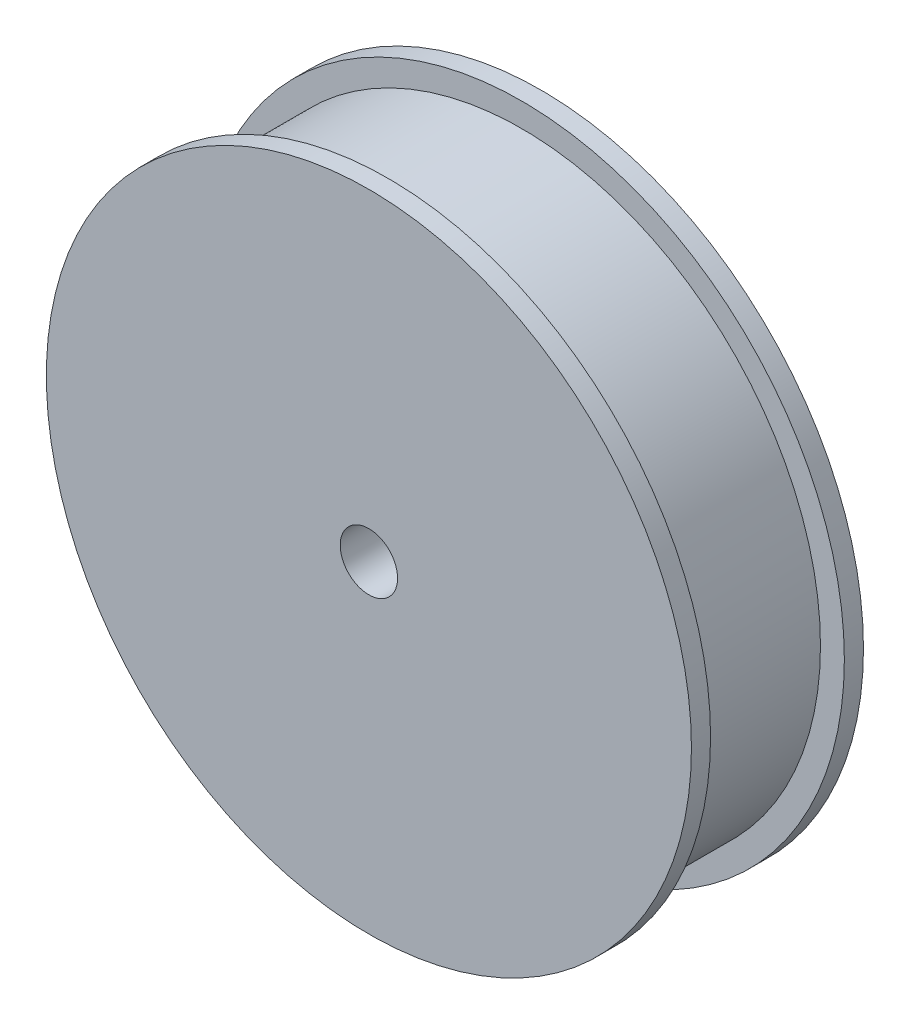
ISO-10303-21;
HEADER;
FILE_DESCRIPTION(('STEP AP214'),'2;1');
FILE_NAME('part.step','',(''),(''),'','','');
FILE_SCHEMA(('AUTOMOTIVE_DESIGN { 1 0 10303 214 1 1 1 1 }'));
ENDSEC;
DATA;
#1=APPLICATION_CONTEXT('core data for automotive mechanical design processes');
#2=APPLICATION_PROTOCOL_DEFINITION('international standard','automotive_design',2000,#1);
#3=PRODUCT_CONTEXT('',#1,'mechanical');
#4=PRODUCT('Part','Part','',(#3));
#5=PRODUCT_RELATED_PRODUCT_CATEGORY('part','',(#4));
#6=PRODUCT_DEFINITION_FORMATION('','',#4);
#7=PRODUCT_DEFINITION_CONTEXT('part definition',#1,'design');
#8=PRODUCT_DEFINITION('design','',#6,#7);
#9=PRODUCT_DEFINITION_SHAPE('','',#8);
#10=(LENGTH_UNIT() NAMED_UNIT(*) SI_UNIT(.MILLI.,.METRE.));
#11=(NAMED_UNIT(*) PLANE_ANGLE_UNIT() SI_UNIT($,.RADIAN.));
#12=(NAMED_UNIT(*) SI_UNIT($,.STERADIAN.) SOLID_ANGLE_UNIT());
#13=UNCERTAINTY_MEASURE_WITH_UNIT(LENGTH_MEASURE(1.E-05),#10,'distance_accuracy_value','');
#14=(GEOMETRIC_REPRESENTATION_CONTEXT(3) GLOBAL_UNCERTAINTY_ASSIGNED_CONTEXT((#13)) GLOBAL_UNIT_ASSIGNED_CONTEXT((#10,
#11,#12)) REPRESENTATION_CONTEXT('',''));
#15=CARTESIAN_POINT('',(0.,0.,0.));
#16=DIRECTION('',(0.,0.,1.));
#17=DIRECTION('',(1.,0.,0.));
#18=AXIS2_PLACEMENT_3D('',#15,#16,#17);
#19=CARTESIAN_POINT('',(0.,0.,8.));
#20=DIRECTION('',(0.,0.,-1.));
#21=DIRECTION('',(-1.,0.,0.));
#22=AXIS2_PLACEMENT_3D('',#19,#20,#21);
#23=CYLINDRICAL_SURFACE('',#22,31.25);
#24=CARTESIAN_POINT('',(0.,0.,7.));
#25=DIRECTION('',(0.,0.,1.));
#26=DIRECTION('',(1.,0.,0.));
#27=AXIS2_PLACEMENT_3D('',#24,#25,#26);
#28=CIRCLE('',#27,31.25);
#29=CARTESIAN_POINT('',(31.25,0.,7.));
#30=VERTEX_POINT('',#29);
#31=EDGE_CURVE('E46',#30,#30,#28,.T.);
#32=ORIENTED_EDGE('',*,*,#31,.F.);
#33=EDGE_LOOP('',(#32));
#34=FACE_BOUND('',#33,.T.);
#35=CARTESIAN_POINT('',(0.,0.,-7.));
#36=DIRECTION('',(0.,0.,-1.));
#37=DIRECTION('',(-1.,0.,0.));
#38=AXIS2_PLACEMENT_3D('',#35,#36,#37);
#39=CIRCLE('',#38,31.25);
#40=CARTESIAN_POINT('',(-31.25,0.,-7.));
#41=VERTEX_POINT('',#40);
#42=EDGE_CURVE('E10',#41,#41,#39,.T.);
#43=ORIENTED_EDGE('',*,*,#42,.F.);
#44=EDGE_LOOP('',(#43));
#45=FACE_BOUND('',#44,.T.);
#46=ADVANCED_FACE('F43',(#34,#45),#23,.T.);
#47=CARTESIAN_POINT('',(0.,0.,8.));
#48=DIRECTION('',(0.,0.,-1.));
#49=DIRECTION('',(-1.,0.,0.));
#50=AXIS2_PLACEMENT_3D('',#47,#48,#49);
#51=CYLINDRICAL_SURFACE('',#50,3.);
#52=CARTESIAN_POINT('',(0.,0.,9.));
#53=DIRECTION('',(0.,0.,1.));
#54=DIRECTION('',(1.,0.,0.));
#55=AXIS2_PLACEMENT_3D('',#52,#53,#54);
#56=CIRCLE('',#55,3.);
#57=CARTESIAN_POINT('',(3.,0.,9.));
#58=VERTEX_POINT('',#57);
#59=EDGE_CURVE('E59',#58,#58,#56,.T.);
#60=ORIENTED_EDGE('',*,*,#59,.T.);
#61=EDGE_LOOP('',(#60));
#62=FACE_BOUND('',#61,.T.);
#63=CARTESIAN_POINT('',(0.,0.,-9.));
#64=DIRECTION('',(0.,0.,1.));
#65=DIRECTION('',(1.,0.,0.));
#66=AXIS2_PLACEMENT_3D('',#63,#64,#65);
#67=CIRCLE('',#66,3.);
#68=CARTESIAN_POINT('',(3.,0.,-9.));
#69=VERTEX_POINT('',#68);
#70=EDGE_CURVE('E110',#69,#69,#67,.T.);
#71=ORIENTED_EDGE('',*,*,#70,.F.);
#72=EDGE_LOOP('',(#71));
#73=FACE_BOUND('',#72,.T.);
#74=ADVANCED_FACE('F74',(#62,#73),#51,.F.);
#75=CARTESIAN_POINT('',(0.,0.,7.));
#76=DIRECTION('',(0.,0.,1.));
#77=DIRECTION('',(1.,0.,0.));
#78=AXIS2_PLACEMENT_3D('',#75,#76,#77);
#79=PLANE('',#78);
#80=CARTESIAN_POINT('',(0.,0.,7.));
#81=DIRECTION('',(0.,0.,1.));
#82=DIRECTION('',(1.,0.,0.));
#83=AXIS2_PLACEMENT_3D('',#80,#81,#82);
#84=CIRCLE('',#83,33.75);
#85=CARTESIAN_POINT('',(33.75,0.,7.));
#86=VERTEX_POINT('',#85);
#87=EDGE_CURVE('E62',#86,#86,#84,.T.);
#88=ORIENTED_EDGE('',*,*,#87,.F.);
#89=EDGE_LOOP('',(#88));
#90=FACE_BOUND('',#89,.T.);
#91=ORIENTED_EDGE('',*,*,#31,.T.);
#92=EDGE_LOOP('',(#91));
#93=FACE_BOUND('',#92,.T.);
#94=ADVANCED_FACE('F70',(#90,#93),#79,.F.);
#95=CARTESIAN_POINT('',(0.,0.,9.));
#96=DIRECTION('',(0.,0.,1.));
#97=DIRECTION('',(1.,0.,0.));
#98=AXIS2_PLACEMENT_3D('',#95,#96,#97);
#99=PLANE('',#98);
#100=CARTESIAN_POINT('',(0.,0.,9.));
#101=DIRECTION('',(0.,0.,1.));
#102=DIRECTION('',(1.,0.,0.));
#103=AXIS2_PLACEMENT_3D('',#100,#101,#102);
#104=CIRCLE('',#103,33.75);
#105=CARTESIAN_POINT('',(33.75,0.,9.));
#106=VERTEX_POINT('',#105);
#107=EDGE_CURVE('E54',#106,#106,#104,.T.);
#108=ORIENTED_EDGE('',*,*,#107,.T.);
#109=EDGE_LOOP('',(#108));
#110=FACE_BOUND('',#109,.T.);
#111=ORIENTED_EDGE('',*,*,#59,.F.);
#112=EDGE_LOOP('',(#111));
#113=FACE_BOUND('',#112,.T.);
#114=ADVANCED_FACE('F73',(#110,#113),#99,.T.);
#115=CARTESIAN_POINT('',(0.,0.,9.));
#116=DIRECTION('',(0.,0.,-1.));
#117=DIRECTION('',(-1.,0.,0.));
#118=AXIS2_PLACEMENT_3D('',#115,#116,#117);
#119=CYLINDRICAL_SURFACE('',#118,33.75);
#120=ORIENTED_EDGE('',*,*,#107,.F.);
#121=EDGE_LOOP('',(#120));
#122=FACE_BOUND('',#121,.T.);
#123=ORIENTED_EDGE('',*,*,#87,.T.);
#124=EDGE_LOOP('',(#123));
#125=FACE_BOUND('',#124,.T.);
#126=ADVANCED_FACE('F68',(#122,#125),#119,.T.);
#127=CARTESIAN_POINT('',(0.,0.,-7.));
#128=DIRECTION('',(0.,0.,-1.));
#129=DIRECTION('',(1.,0.,0.));
#130=AXIS2_PLACEMENT_3D('',#127,#128,#129);
#131=PLANE('',#130);
#132=CARTESIAN_POINT('',(0.,0.,-7.));
#133=DIRECTION('',(0.,0.,1.));
#134=DIRECTION('',(1.,0.,0.));
#135=AXIS2_PLACEMENT_3D('',#132,#133,#134);
#136=CIRCLE('',#135,33.75);
#137=CARTESIAN_POINT('',(33.75,0.,-7.));
#138=VERTEX_POINT('',#137);
#139=EDGE_CURVE('E57',#138,#138,#136,.T.);
#140=ORIENTED_EDGE('',*,*,#139,.T.);
#141=EDGE_LOOP('',(#140));
#142=FACE_BOUND('',#141,.T.);
#143=ORIENTED_EDGE('',*,*,#42,.T.);
#144=EDGE_LOOP('',(#143));
#145=FACE_BOUND('',#144,.T.);
#146=ADVANCED_FACE('F89',(#142,#145),#131,.F.);
#147=CARTESIAN_POINT('',(0.,0.,-9.));
#148=DIRECTION('',(0.,0.,1.));
#149=DIRECTION('',(1.,0.,0.));
#150=AXIS2_PLACEMENT_3D('',#147,#148,#149);
#151=CYLINDRICAL_SURFACE('',#150,33.75);
#152=CARTESIAN_POINT('',(0.,0.,-9.));
#153=DIRECTION('',(0.,0.,1.));
#154=DIRECTION('',(1.,0.,0.));
#155=AXIS2_PLACEMENT_3D('',#152,#153,#154);
#156=CIRCLE('',#155,33.75);
#157=CARTESIAN_POINT('',(33.75,0.,-9.));
#158=VERTEX_POINT('',#157);
#159=EDGE_CURVE('E63',#158,#158,#156,.T.);
#160=ORIENTED_EDGE('',*,*,#159,.T.);
#161=EDGE_LOOP('',(#160));
#162=FACE_BOUND('',#161,.T.);
#163=ORIENTED_EDGE('',*,*,#139,.F.);
#164=EDGE_LOOP('',(#163));
#165=FACE_BOUND('',#164,.T.);
#166=ADVANCED_FACE('F95',(#162,#165),#151,.T.);
#167=CARTESIAN_POINT('',(0.,0.,-9.));
#168=DIRECTION('',(0.,0.,-1.));
#169=DIRECTION('',(1.,0.,0.));
#170=AXIS2_PLACEMENT_3D('',#167,#168,#169);
#171=PLANE('',#170);
#172=ORIENTED_EDGE('',*,*,#70,.T.);
#173=EDGE_LOOP('',(#172));
#174=FACE_BOUND('',#173,.T.);
#175=ORIENTED_EDGE('',*,*,#159,.F.);
#176=EDGE_LOOP('',(#175));
#177=FACE_BOUND('',#176,.T.);
#178=ADVANCED_FACE('F98',(#174,#177),#171,.T.);
#179=CLOSED_SHELL('',(#46,#74,#94,#114,#126,#146,#166,#178));
#180=MANIFOLD_SOLID_BREP('B2',#179);
#181=ADVANCED_BREP_SHAPE_REPRESENTATION('',(#18,#180),#14);
#182=SHAPE_DEFINITION_REPRESENTATION(#9,#181);
ENDSEC;
END-ISO-10303-21;
